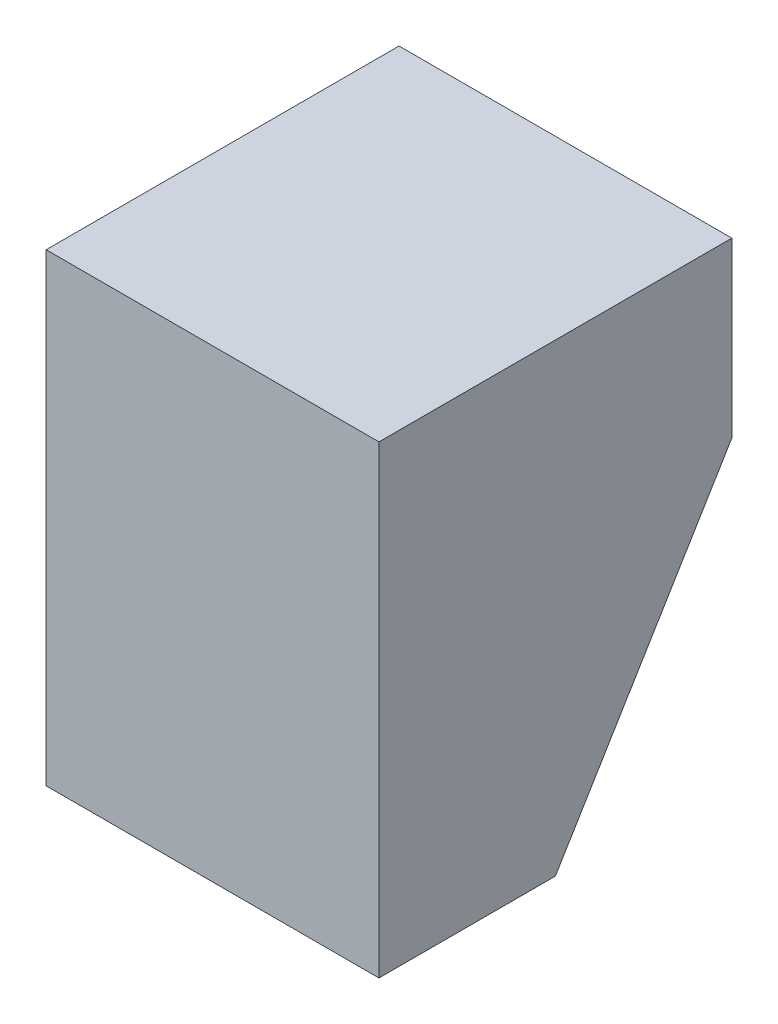
ISO-10303-21;
HEADER;
FILE_DESCRIPTION(('STEP AP214'),'2;1');
FILE_NAME('part.step','',(''),(''),'','','');
FILE_SCHEMA(('AUTOMOTIVE_DESIGN { 1 0 10303 214 1 1 1 1 }'));
ENDSEC;
DATA;
#1=APPLICATION_CONTEXT('core data for automotive mechanical design processes');
#2=APPLICATION_PROTOCOL_DEFINITION('international standard','automotive_design',2000,#1);
#3=PRODUCT_CONTEXT('',#1,'mechanical');
#4=PRODUCT('Part','Part','',(#3));
#5=PRODUCT_RELATED_PRODUCT_CATEGORY('part','',(#4));
#6=PRODUCT_DEFINITION_FORMATION('','',#4);
#7=PRODUCT_DEFINITION_CONTEXT('part definition',#1,'design');
#8=PRODUCT_DEFINITION('design','',#6,#7);
#9=PRODUCT_DEFINITION_SHAPE('','',#8);
#10=(LENGTH_UNIT() NAMED_UNIT(*) SI_UNIT(.MILLI.,.METRE.));
#11=(NAMED_UNIT(*) PLANE_ANGLE_UNIT() SI_UNIT($,.RADIAN.));
#12=(NAMED_UNIT(*) SI_UNIT($,.STERADIAN.) SOLID_ANGLE_UNIT());
#13=UNCERTAINTY_MEASURE_WITH_UNIT(LENGTH_MEASURE(1.E-05),#10,'distance_accuracy_value','');
#14=(GEOMETRIC_REPRESENTATION_CONTEXT(3) GLOBAL_UNCERTAINTY_ASSIGNED_CONTEXT((#13)) GLOBAL_UNIT_ASSIGNED_CONTEXT((#10,
#11,#12)) REPRESENTATION_CONTEXT('',''));
#15=CARTESIAN_POINT('',(0.,0.,0.));
#16=DIRECTION('',(0.,0.,1.));
#17=DIRECTION('',(1.,0.,0.));
#18=AXIS2_PLACEMENT_3D('',#15,#16,#17);
#19=CARTESIAN_POINT('',(125.,-75.,114.));
#20=DIRECTION('',(-1.,0.,0.));
#21=DIRECTION('',(0.,0.,1.));
#22=AXIS2_PLACEMENT_3D('',#19,#20,#21);
#23=PLANE('',#22);
#24=DIRECTION('',(0.,-0.855226725322334,0.518254038377355));
#25=VECTOR('',#24,1.);
#26=CARTESIAN_POINT('',(125.,-100.263808135213,72.3094731527829));
#27=LINE('',#26,#25);
#28=CARTESIAN_POINT('',(125.,19.0618301711685,0.));
#29=VERTEX_POINT('',#28);
#30=CARTESIAN_POINT('',(125.,-75.,56.9999999999999));
#31=VERTEX_POINT('',#30);
#32=EDGE_CURVE('E108',#29,#31,#27,.T.);
#33=ORIENTED_EDGE('',*,*,#32,.F.);
#34=DIRECTION('',(0.,1.,0.));
#35=VECTOR('',#34,1.);
#36=CARTESIAN_POINT('',(125.,-75.,0.));
#37=LINE('',#36,#35);
#38=CARTESIAN_POINT('',(125.,75.,0.));
#39=VERTEX_POINT('',#38);
#40=EDGE_CURVE('E100',#29,#39,#37,.T.);
#41=ORIENTED_EDGE('',*,*,#40,.T.);
#42=DIRECTION('',(0.,0.,-1.));
#43=VECTOR('',#42,1.);
#44=CARTESIAN_POINT('',(125.,75.,114.));
#45=LINE('',#44,#43);
#46=CARTESIAN_POINT('',(125.,75.,114.));
#47=VERTEX_POINT('',#46);
#48=EDGE_CURVE('E112',#47,#39,#45,.T.);
#49=ORIENTED_EDGE('',*,*,#48,.F.);
#50=DIRECTION('',(0.,1.,0.));
#51=VECTOR('',#50,1.);
#52=CARTESIAN_POINT('',(125.,-75.,114.));
#53=LINE('',#52,#51);
#54=CARTESIAN_POINT('',(125.,-75.,114.));
#55=VERTEX_POINT('',#54);
#56=EDGE_CURVE('E104',#55,#47,#53,.T.);
#57=ORIENTED_EDGE('',*,*,#56,.F.);
#58=DIRECTION('',(0.,0.,-1.));
#59=VECTOR('',#58,1.);
#60=CARTESIAN_POINT('',(125.,-75.,114.));
#61=LINE('',#60,#59);
#62=EDGE_CURVE('E95',#55,#31,#61,.T.);
#63=ORIENTED_EDGE('',*,*,#62,.T.);
#64=EDGE_LOOP('',(#33,#41,#49,#57,#63));
#65=FACE_BOUND('',#64,.T.);
#66=ADVANCED_FACE('F34',(#65),#23,.F.);
#67=CARTESIAN_POINT('',(-125.,-75.,114.));
#68=DIRECTION('',(0.,1.,0.));
#69=DIRECTION('',(0.,0.,1.));
#70=AXIS2_PLACEMENT_3D('',#67,#68,#69);
#71=PLANE('',#70);
#72=DIRECTION('',(1.,0.,0.));
#73=VECTOR('',#72,1.);
#74=CARTESIAN_POINT('',(-125.,-75.,114.));
#75=LINE('',#74,#73);
#76=CARTESIAN_POINT('',(17.4871129549344,-75.,114.));
#77=VERTEX_POINT('',#76);
#78=EDGE_CURVE('E90',#77,#55,#75,.T.);
#79=ORIENTED_EDGE('',*,*,#78,.F.);
#80=DIRECTION('',(0.,0.,1.));
#81=VECTOR('',#80,1.);
#82=CARTESIAN_POINT('',(17.4871129549344,-75.,-16.0571550711005));
#83=LINE('',#82,#81);
#84=CARTESIAN_POINT('',(17.4871129549344,-75.,0.));
#85=VERTEX_POINT('',#84);
#86=EDGE_CURVE('E11',#85,#77,#83,.T.);
#87=ORIENTED_EDGE('',*,*,#86,.F.);
#88=DIRECTION('',(1.,0.,0.));
#89=VECTOR('',#88,1.);
#90=CARTESIAN_POINT('',(-125.,-75.,0.));
#91=LINE('',#90,#89);
#92=CARTESIAN_POINT('',(42.292495755744,-75.,0.));
#93=VERTEX_POINT('',#92);
#94=EDGE_CURVE('E87',#85,#93,#91,.T.);
#95=ORIENTED_EDGE('',*,*,#94,.T.);
#96=DIRECTION('',(-0.823397266330031,0.,-0.567465366168044));
#97=VECTOR('',#96,1.);
#98=CARTESIAN_POINT('',(-17.862546969277,-75.,-41.4573921273211));
#99=LINE('',#98,#97);
#100=EDGE_CURVE('E82',#31,#93,#99,.T.);
#101=ORIENTED_EDGE('',*,*,#100,.F.);
#102=ORIENTED_EDGE('',*,*,#62,.F.);
#103=EDGE_LOOP('',(#79,#87,#95,#101,#102));
#104=FACE_BOUND('',#103,.T.);
#105=ADVANCED_FACE('F36',(#104),#71,.F.);
#106=CARTESIAN_POINT('',(0.,0.,0.));
#107=DIRECTION('',(0.,0.,-1.));
#108=DIRECTION('',(-1.,0.,0.));
#109=AXIS2_PLACEMENT_3D('',#106,#107,#108);
#110=PLANE('',#109);
#111=DIRECTION('',(0.,-1.,0.));
#112=VECTOR('',#111,1.);
#113=CARTESIAN_POINT('',(17.4871129549344,0.,0.));
#114=LINE('',#113,#112);
#115=CARTESIAN_POINT('',(17.4871129549344,75.,0.));
#116=VERTEX_POINT('',#115);
#117=EDGE_CURVE('E44',#116,#85,#114,.T.);
#118=ORIENTED_EDGE('',*,*,#117,.F.);
#119=DIRECTION('',(-1.,0.,0.));
#120=VECTOR('',#119,1.);
#121=CARTESIAN_POINT('',(-125.,75.,0.));
#122=LINE('',#121,#120);
#123=EDGE_CURVE('E97',#39,#116,#122,.T.);
#124=ORIENTED_EDGE('',*,*,#123,.F.);
#125=ORIENTED_EDGE('',*,*,#40,.F.);
#126=DIRECTION('',(-0.66032679808164,-0.750978375011724,0.));
#127=VECTOR('',#126,1.);
#128=CARTESIAN_POINT('',(61.0434721622796,-53.6748351989157,0.));
#129=LINE('',#128,#127);
#130=EDGE_CURVE('E94',#29,#93,#129,.T.);
#131=ORIENTED_EDGE('',*,*,#130,.T.);
#132=ORIENTED_EDGE('',*,*,#94,.F.);
#133=EDGE_LOOP('',(#118,#124,#125,#131,#132));
#134=FACE_BOUND('',#133,.T.);
#135=ADVANCED_FACE('F92',(#134),#110,.T.);
#136=CARTESIAN_POINT('',(-125.,75.,114.));
#137=DIRECTION('',(0.,-1.,0.));
#138=DIRECTION('',(0.,0.,-1.));
#139=AXIS2_PLACEMENT_3D('',#136,#137,#138);
#140=PLANE('',#139);
#141=ORIENTED_EDGE('',*,*,#123,.T.);
#142=DIRECTION('',(0.,0.,1.));
#143=VECTOR('',#142,1.);
#144=CARTESIAN_POINT('',(17.4871129549344,75.,-16.0571550711005));
#145=LINE('',#144,#143);
#146=CARTESIAN_POINT('',(17.4871129549344,75.,114.));
#147=VERTEX_POINT('',#146);
#148=EDGE_CURVE('E52',#116,#147,#145,.T.);
#149=ORIENTED_EDGE('',*,*,#148,.T.);
#150=DIRECTION('',(-1.,0.,0.));
#151=VECTOR('',#150,1.);
#152=CARTESIAN_POINT('',(-125.,75.,114.));
#153=LINE('',#152,#151);
#154=EDGE_CURVE('E38',#47,#147,#153,.T.);
#155=ORIENTED_EDGE('',*,*,#154,.F.);
#156=ORIENTED_EDGE('',*,*,#48,.T.);
#157=EDGE_LOOP('',(#141,#149,#155,#156));
#158=FACE_BOUND('',#157,.T.);
#159=ADVANCED_FACE('F120',(#158),#140,.F.);
#160=CARTESIAN_POINT('',(0.,0.,114.));
#161=DIRECTION('',(0.,0.,-1.));
#162=DIRECTION('',(-1.,0.,0.));
#163=AXIS2_PLACEMENT_3D('',#160,#161,#162);
#164=PLANE('',#163);
#165=ORIENTED_EDGE('',*,*,#154,.T.);
#166=DIRECTION('',(0.,-1.,0.));
#167=VECTOR('',#166,1.);
#168=CARTESIAN_POINT('',(17.4871129549344,0.,114.));
#169=LINE('',#168,#167);
#170=EDGE_CURVE('E105',#147,#77,#169,.T.);
#171=ORIENTED_EDGE('',*,*,#170,.T.);
#172=ORIENTED_EDGE('',*,*,#78,.T.);
#173=ORIENTED_EDGE('',*,*,#56,.T.);
#174=EDGE_LOOP('',(#165,#171,#172,#173));
#175=FACE_BOUND('',#174,.T.);
#176=ADVANCED_FACE('F121',(#175),#164,.F.);
#177=CARTESIAN_POINT('',(27.9069349234818,-24.5382524923008,-40.4932094496149));
#178=DIRECTION('',(0.507766315458884,-0.446473182740372,-0.736773415629929));
#179=DIRECTION('',(-0.823397266330031,0.,-0.567465366168044));
#180=AXIS2_PLACEMENT_3D('',#177,#178,#179);
#181=PLANE('',#180);
#182=ORIENTED_EDGE('',*,*,#32,.T.);
#183=ORIENTED_EDGE('',*,*,#100,.T.);
#184=ORIENTED_EDGE('',*,*,#130,.F.);
#185=EDGE_LOOP('',(#182,#183,#184));
#186=FACE_BOUND('',#185,.T.);
#187=ADVANCED_FACE('F126',(#186),#181,.T.);
#188=CARTESIAN_POINT('',(17.4871129549344,75.,-16.0571550711005));
#189=DIRECTION('',(1.,0.,0.));
#190=DIRECTION('',(0.,0.,-1.));
#191=AXIS2_PLACEMENT_3D('',#188,#189,#190);
#192=PLANE('',#191);
#193=ORIENTED_EDGE('',*,*,#117,.T.);
#194=ORIENTED_EDGE('',*,*,#86,.T.);
#195=ORIENTED_EDGE('',*,*,#170,.F.);
#196=ORIENTED_EDGE('',*,*,#148,.F.);
#197=EDGE_LOOP('',(#193,#194,#195,#196));
#198=FACE_BOUND('',#197,.T.);
#199=ADVANCED_FACE('F77',(#198),#192,.F.);
#200=CLOSED_SHELL('',(#66,#105,#135,#159,#176,#187,#199));
#201=MANIFOLD_SOLID_BREP('B2',#200);
#202=ADVANCED_BREP_SHAPE_REPRESENTATION('',(#18,#201),#14);
#203=SHAPE_DEFINITION_REPRESENTATION(#9,#202);
ENDSEC;
END-ISO-10303-21;
